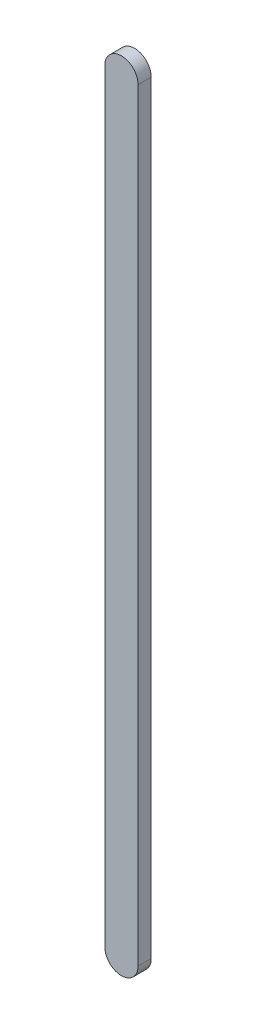
ISO-10303-21;
HEADER;
FILE_DESCRIPTION(('STEP AP214'),'2;1');
FILE_NAME('part.step','',(''),(''),'','','');
FILE_SCHEMA(('AUTOMOTIVE_DESIGN { 1 0 10303 214 1 1 1 1 }'));
ENDSEC;
DATA;
#1=APPLICATION_CONTEXT('core data for automotive mechanical design processes');
#2=APPLICATION_PROTOCOL_DEFINITION('international standard','automotive_design',2000,#1);
#3=PRODUCT_CONTEXT('',#1,'mechanical');
#4=PRODUCT('Part','Part','',(#3));
#5=PRODUCT_RELATED_PRODUCT_CATEGORY('part','',(#4));
#6=PRODUCT_DEFINITION_FORMATION('','',#4);
#7=PRODUCT_DEFINITION_CONTEXT('part definition',#1,'design');
#8=PRODUCT_DEFINITION('design','',#6,#7);
#9=PRODUCT_DEFINITION_SHAPE('','',#8);
#10=(LENGTH_UNIT() NAMED_UNIT(*) SI_UNIT(.MILLI.,.METRE.));
#11=(NAMED_UNIT(*) PLANE_ANGLE_UNIT() SI_UNIT($,.RADIAN.));
#12=(NAMED_UNIT(*) SI_UNIT($,.STERADIAN.) SOLID_ANGLE_UNIT());
#13=UNCERTAINTY_MEASURE_WITH_UNIT(LENGTH_MEASURE(1.E-05),#10,'distance_accuracy_value','');
#14=(GEOMETRIC_REPRESENTATION_CONTEXT(3) GLOBAL_UNCERTAINTY_ASSIGNED_CONTEXT((#13)) GLOBAL_UNIT_ASSIGNED_CONTEXT((#10,
#11,#12)) REPRESENTATION_CONTEXT('',''));
#15=CARTESIAN_POINT('',(0.,0.,0.));
#16=DIRECTION('',(0.,0.,1.));
#17=DIRECTION('',(1.,0.,0.));
#18=AXIS2_PLACEMENT_3D('',#15,#16,#17);
#19=CARTESIAN_POINT('',(110.9218,54.8386,0.));
#20=DIRECTION('',(-1.,0.,0.));
#21=DIRECTION('',(0.,1.,0.));
#22=AXIS2_PLACEMENT_3D('',#19,#20,#21);
#23=PLANE('',#22);
#24=DIRECTION('',(0.,1.,0.));
#25=VECTOR('',#24,1.);
#26=CARTESIAN_POINT('',(110.9218,54.8386,0.1999996));
#27=LINE('',#26,#25);
#28=CARTESIAN_POINT('',(110.9218,54.8386,0.1999996));
#29=VERTEX_POINT('',#28);
#30=CARTESIAN_POINT('',(110.9218,66.4718,0.1999996));
#31=VERTEX_POINT('',#30);
#32=EDGE_CURVE('E11',#29,#31,#27,.T.);
#33=ORIENTED_EDGE('',*,*,#32,.F.);
#34=DIRECTION('',(0.,0.,1.));
#35=VECTOR('',#34,1.);
#36=CARTESIAN_POINT('',(110.9218,54.8386,0.));
#37=LINE('',#36,#35);
#38=CARTESIAN_POINT('',(110.9218,54.8386,0.));
#39=VERTEX_POINT('',#38);
#40=EDGE_CURVE('E24',#39,#29,#37,.T.);
#41=ORIENTED_EDGE('',*,*,#40,.F.);
#42=DIRECTION('',(0.,1.,0.));
#43=VECTOR('',#42,1.);
#44=CARTESIAN_POINT('',(110.9218,54.8386,0.));
#45=LINE('',#44,#43);
#46=CARTESIAN_POINT('',(110.9218,66.4718,0.));
#47=VERTEX_POINT('',#46);
#48=EDGE_CURVE('E75',#39,#47,#45,.T.);
#49=ORIENTED_EDGE('',*,*,#48,.T.);
#50=DIRECTION('',(0.,0.,1.));
#51=VECTOR('',#50,1.);
#52=CARTESIAN_POINT('',(110.9218,66.4718,0.));
#53=LINE('',#52,#51);
#54=EDGE_CURVE('E37',#47,#31,#53,.T.);
#55=ORIENTED_EDGE('',*,*,#54,.T.);
#56=EDGE_LOOP('',(#33,#41,#49,#55));
#57=FACE_BOUND('',#56,.T.);
#58=ADVANCED_FACE('F17',(#57),#23,.F.);
#59=CARTESIAN_POINT('',(110.6678,66.4718,0.));
#60=DIRECTION('',(0.,0.,-1.));
#61=DIRECTION('',(1.,0.,0.));
#62=AXIS2_PLACEMENT_3D('',#59,#60,#61);
#63=CYLINDRICAL_SURFACE('',#62,0.254000000000005);
#64=CARTESIAN_POINT('',(110.6678,66.4718,0.1999996));
#65=DIRECTION('',(0.,0.,1.));
#66=DIRECTION('',(1.,0.,0.));
#67=AXIS2_PLACEMENT_3D('',#64,#65,#66);
#68=CIRCLE('',#67,0.254000000000005);
#69=CARTESIAN_POINT('',(110.4138,66.4718,0.1999996));
#70=VERTEX_POINT('',#69);
#71=EDGE_CURVE('E83',#31,#70,#68,.T.);
#72=ORIENTED_EDGE('',*,*,#71,.F.);
#73=ORIENTED_EDGE('',*,*,#54,.F.);
#74=CARTESIAN_POINT('',(110.6678,66.4718,0.));
#75=DIRECTION('',(0.,0.,1.));
#76=DIRECTION('',(1.,0.,0.));
#77=AXIS2_PLACEMENT_3D('',#74,#75,#76);
#78=CIRCLE('',#77,0.254000000000005);
#79=CARTESIAN_POINT('',(110.4138,66.4718,0.));
#80=VERTEX_POINT('',#79);
#81=EDGE_CURVE('E81',#47,#80,#78,.T.);
#82=ORIENTED_EDGE('',*,*,#81,.T.);
#83=DIRECTION('',(0.,0.,1.));
#84=VECTOR('',#83,1.);
#85=CARTESIAN_POINT('',(110.4138,66.4718,0.));
#86=LINE('',#85,#84);
#87=EDGE_CURVE('E67',#80,#70,#86,.T.);
#88=ORIENTED_EDGE('',*,*,#87,.T.);
#89=EDGE_LOOP('',(#72,#73,#82,#88));
#90=FACE_BOUND('',#89,.T.);
#91=ADVANCED_FACE('F89',(#90),#63,.T.);
#92=CARTESIAN_POINT('',(110.4138,66.4718,0.));
#93=DIRECTION('',(1.,0.,0.));
#94=DIRECTION('',(0.,-1.,0.));
#95=AXIS2_PLACEMENT_3D('',#92,#93,#94);
#96=PLANE('',#95);
#97=DIRECTION('',(0.,-1.,0.));
#98=VECTOR('',#97,1.);
#99=CARTESIAN_POINT('',(110.4138,66.4718,0.1999996));
#100=LINE('',#99,#98);
#101=CARTESIAN_POINT('',(110.4138,54.8386,0.1999996));
#102=VERTEX_POINT('',#101);
#103=EDGE_CURVE('E71',#70,#102,#100,.T.);
#104=ORIENTED_EDGE('',*,*,#103,.F.);
#105=ORIENTED_EDGE('',*,*,#87,.F.);
#106=DIRECTION('',(0.,-1.,0.));
#107=VECTOR('',#106,1.);
#108=CARTESIAN_POINT('',(110.4138,66.4718,0.));
#109=LINE('',#108,#107);
#110=CARTESIAN_POINT('',(110.4138,54.8386,0.));
#111=VERTEX_POINT('',#110);
#112=EDGE_CURVE('E63',#80,#111,#109,.T.);
#113=ORIENTED_EDGE('',*,*,#112,.T.);
#114=DIRECTION('',(0.,0.,1.));
#115=VECTOR('',#114,1.);
#116=CARTESIAN_POINT('',(110.4138,54.8386,0.));
#117=LINE('',#116,#115);
#118=EDGE_CURVE('E53',#111,#102,#117,.T.);
#119=ORIENTED_EDGE('',*,*,#118,.T.);
#120=EDGE_LOOP('',(#104,#105,#113,#119));
#121=FACE_BOUND('',#120,.T.);
#122=ADVANCED_FACE('F66',(#121),#96,.F.);
#123=CARTESIAN_POINT('',(110.6678,54.8386,0.));
#124=DIRECTION('',(0.,0.,-1.));
#125=DIRECTION('',(-1.,0.,0.));
#126=AXIS2_PLACEMENT_3D('',#123,#124,#125);
#127=CYLINDRICAL_SURFACE('',#126,0.254000000000007);
#128=CARTESIAN_POINT('',(110.6678,54.8386,0.1999996));
#129=DIRECTION('',(0.,0.,1.));
#130=DIRECTION('',(-1.,0.,0.));
#131=AXIS2_PLACEMENT_3D('',#128,#129,#130);
#132=CIRCLE('',#131,0.254000000000007);
#133=EDGE_CURVE('E59',#102,#29,#132,.T.);
#134=ORIENTED_EDGE('',*,*,#133,.F.);
#135=ORIENTED_EDGE('',*,*,#118,.F.);
#136=CARTESIAN_POINT('',(110.6678,54.8386,0.));
#137=DIRECTION('',(0.,0.,1.));
#138=DIRECTION('',(-1.,0.,0.));
#139=AXIS2_PLACEMENT_3D('',#136,#137,#138);
#140=CIRCLE('',#139,0.254000000000007);
#141=EDGE_CURVE('E57',#111,#39,#140,.T.);
#142=ORIENTED_EDGE('',*,*,#141,.T.);
#143=ORIENTED_EDGE('',*,*,#40,.T.);
#144=EDGE_LOOP('',(#134,#135,#142,#143));
#145=FACE_BOUND('',#144,.T.);
#146=ADVANCED_FACE('F55',(#145),#127,.T.);
#147=CARTESIAN_POINT('',(110.9218,54.8386,0.));
#148=DIRECTION('',(0.,0.,-1.));
#149=DIRECTION('',(-1.,0.,0.));
#150=AXIS2_PLACEMENT_3D('',#147,#148,#149);
#151=PLANE('',#150);
#152=ORIENTED_EDGE('',*,*,#141,.F.);
#153=ORIENTED_EDGE('',*,*,#112,.F.);
#154=ORIENTED_EDGE('',*,*,#81,.F.);
#155=ORIENTED_EDGE('',*,*,#48,.F.);
#156=EDGE_LOOP('',(#152,#153,#154,#155));
#157=FACE_BOUND('',#156,.T.);
#158=ADVANCED_FACE('F74',(#157),#151,.T.);
#159=CARTESIAN_POINT('',(110.9218,54.8386,0.1999996));
#160=DIRECTION('',(0.,0.,-1.));
#161=DIRECTION('',(-1.,0.,0.));
#162=AXIS2_PLACEMENT_3D('',#159,#160,#161);
#163=PLANE('',#162);
#164=ORIENTED_EDGE('',*,*,#32,.T.);
#165=ORIENTED_EDGE('',*,*,#71,.T.);
#166=ORIENTED_EDGE('',*,*,#103,.T.);
#167=ORIENTED_EDGE('',*,*,#133,.T.);
#168=EDGE_LOOP('',(#164,#165,#166,#167));
#169=FACE_BOUND('',#168,.T.);
#170=ADVANCED_FACE('F91',(#169),#163,.F.);
#171=CLOSED_SHELL('',(#58,#91,#122,#146,#158,#170));
#172=MANIFOLD_SOLID_BREP('B1',#171);
#173=ADVANCED_BREP_SHAPE_REPRESENTATION('',(#18,#172),#14);
#174=SHAPE_DEFINITION_REPRESENTATION(#9,#173);
ENDSEC;
END-ISO-10303-21;
